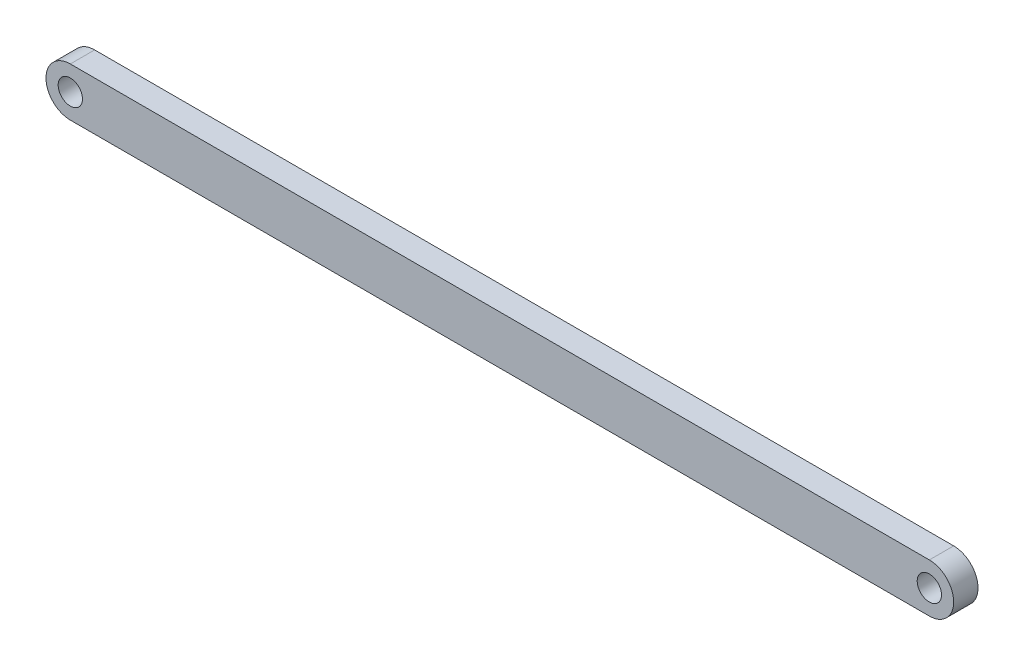
ISO-10303-21;
HEADER;
FILE_DESCRIPTION(('STEP AP214'),'2;1');
FILE_NAME('part.step','',(''),(''),'','','');
FILE_SCHEMA(('AUTOMOTIVE_DESIGN { 1 0 10303 214 1 1 1 1 }'));
ENDSEC;
DATA;
#1=APPLICATION_CONTEXT('core data for automotive mechanical design processes');
#2=APPLICATION_PROTOCOL_DEFINITION('international standard','automotive_design',2000,#1);
#3=PRODUCT_CONTEXT('',#1,'mechanical');
#4=PRODUCT('Part','Part','',(#3));
#5=PRODUCT_RELATED_PRODUCT_CATEGORY('part','',(#4));
#6=PRODUCT_DEFINITION_FORMATION('','',#4);
#7=PRODUCT_DEFINITION_CONTEXT('part definition',#1,'design');
#8=PRODUCT_DEFINITION('design','',#6,#7);
#9=PRODUCT_DEFINITION_SHAPE('','',#8);
#10=(LENGTH_UNIT() NAMED_UNIT(*) SI_UNIT(.MILLI.,.METRE.));
#11=(NAMED_UNIT(*) PLANE_ANGLE_UNIT() SI_UNIT($,.RADIAN.));
#12=(NAMED_UNIT(*) SI_UNIT($,.STERADIAN.) SOLID_ANGLE_UNIT());
#13=UNCERTAINTY_MEASURE_WITH_UNIT(LENGTH_MEASURE(1.E-05),#10,'distance_accuracy_value','');
#14=(GEOMETRIC_REPRESENTATION_CONTEXT(3) GLOBAL_UNCERTAINTY_ASSIGNED_CONTEXT((#13)) GLOBAL_UNIT_ASSIGNED_CONTEXT((#10,
#11,#12)) REPRESENTATION_CONTEXT('',''));
#15=CARTESIAN_POINT('',(0.,0.,0.));
#16=DIRECTION('',(0.,0.,1.));
#17=DIRECTION('',(1.,0.,0.));
#18=AXIS2_PLACEMENT_3D('',#15,#16,#17);
#19=CARTESIAN_POINT('',(-112.141,0.,6.35));
#20=DIRECTION('',(0.,0.,1.));
#21=DIRECTION('',(1.,0.,0.));
#22=AXIS2_PLACEMENT_3D('',#19,#20,#21);
#23=PLANE('',#22);
#24=CARTESIAN_POINT('',(-112.141,0.,6.35));
#25=DIRECTION('',(0.,0.,1.));
#26=DIRECTION('',(1.,0.,0.));
#27=AXIS2_PLACEMENT_3D('',#24,#25,#26);
#28=CIRCLE('',#27,3.175);
#29=CARTESIAN_POINT('',(-108.966,0.,6.35));
#30=VERTEX_POINT('',#29);
#31=EDGE_CURVE('E100',#30,#30,#28,.T.);
#32=ORIENTED_EDGE('',*,*,#31,.F.);
#33=EDGE_LOOP('',(#32));
#34=FACE_BOUND('',#33,.T.);
#35=CARTESIAN_POINT('',(-112.141,0.,6.35));
#36=DIRECTION('',(0.,0.,1.));
#37=DIRECTION('',(1.,0.,0.));
#38=AXIS2_PLACEMENT_3D('',#35,#36,#37);
#39=CIRCLE('',#38,6.35);
#40=CARTESIAN_POINT('',(-112.141,6.35,6.35));
#41=VERTEX_POINT('',#40);
#42=CARTESIAN_POINT('',(-112.141,-6.35,6.35));
#43=VERTEX_POINT('',#42);
#44=EDGE_CURVE('E85',#41,#43,#39,.T.);
#45=ORIENTED_EDGE('',*,*,#44,.T.);
#46=DIRECTION('',(1.,0.,0.));
#47=VECTOR('',#46,1.);
#48=CARTESIAN_POINT('',(-112.141,-6.35,6.35));
#49=LINE('',#48,#47);
#50=CARTESIAN_POINT('',(112.141,-6.34999999999996,6.35));
#51=VERTEX_POINT('',#50);
#52=EDGE_CURVE('E80',#43,#51,#49,.T.);
#53=ORIENTED_EDGE('',*,*,#52,.T.);
#54=CARTESIAN_POINT('',(112.141,0.,6.35));
#55=DIRECTION('',(0.,0.,1.));
#56=DIRECTION('',(1.,0.,0.));
#57=AXIS2_PLACEMENT_3D('',#54,#55,#56);
#58=CIRCLE('',#57,6.35);
#59=CARTESIAN_POINT('',(112.141,6.35000000000004,6.35));
#60=VERTEX_POINT('',#59);
#61=EDGE_CURVE('E83',#51,#60,#58,.T.);
#62=ORIENTED_EDGE('',*,*,#61,.T.);
#63=DIRECTION('',(-1.,0.,0.));
#64=VECTOR('',#63,1.);
#65=CARTESIAN_POINT('',(-112.141,6.35,6.35));
#66=LINE('',#65,#64);
#67=EDGE_CURVE('E50',#60,#41,#66,.T.);
#68=ORIENTED_EDGE('',*,*,#67,.T.);
#69=EDGE_LOOP('',(#45,#53,#62,#68));
#70=FACE_BOUND('',#69,.T.);
#71=CARTESIAN_POINT('',(112.141,0.,6.35));
#72=DIRECTION('',(0.,0.,1.));
#73=DIRECTION('',(1.,0.,0.));
#74=AXIS2_PLACEMENT_3D('',#71,#72,#73);
#75=CIRCLE('',#74,3.175);
#76=CARTESIAN_POINT('',(115.316,0.,6.35));
#77=VERTEX_POINT('',#76);
#78=EDGE_CURVE('E115',#77,#77,#75,.T.);
#79=ORIENTED_EDGE('',*,*,#78,.F.);
#80=EDGE_LOOP('',(#79));
#81=FACE_BOUND('',#80,.T.);
#82=ADVANCED_FACE('F33',(#34,#70,#81),#23,.T.);
#83=CARTESIAN_POINT('',(-112.141,0.,0.));
#84=DIRECTION('',(0.,0.,1.));
#85=DIRECTION('',(1.,0.,0.));
#86=AXIS2_PLACEMENT_3D('',#83,#84,#85);
#87=PLANE('',#86);
#88=CARTESIAN_POINT('',(-112.141,0.,0.));
#89=DIRECTION('',(0.,0.,1.));
#90=DIRECTION('',(1.,0.,0.));
#91=AXIS2_PLACEMENT_3D('',#88,#89,#90);
#92=CIRCLE('',#91,6.35);
#93=CARTESIAN_POINT('',(-112.141,6.35,0.));
#94=VERTEX_POINT('',#93);
#95=CARTESIAN_POINT('',(-112.141,-6.35,0.));
#96=VERTEX_POINT('',#95);
#97=EDGE_CURVE('E97',#94,#96,#92,.T.);
#98=ORIENTED_EDGE('',*,*,#97,.F.);
#99=DIRECTION('',(-1.,0.,0.));
#100=VECTOR('',#99,1.);
#101=CARTESIAN_POINT('',(-112.141,6.35,0.));
#102=LINE('',#101,#100);
#103=CARTESIAN_POINT('',(112.141,6.35000000000004,0.));
#104=VERTEX_POINT('',#103);
#105=EDGE_CURVE('E73',#104,#94,#102,.T.);
#106=ORIENTED_EDGE('',*,*,#105,.F.);
#107=CARTESIAN_POINT('',(112.141,0.,0.));
#108=DIRECTION('',(0.,0.,1.));
#109=DIRECTION('',(1.,0.,0.));
#110=AXIS2_PLACEMENT_3D('',#107,#108,#109);
#111=CIRCLE('',#110,6.35);
#112=CARTESIAN_POINT('',(112.141,-6.34999999999996,0.));
#113=VERTEX_POINT('',#112);
#114=EDGE_CURVE('E67',#113,#104,#111,.T.);
#115=ORIENTED_EDGE('',*,*,#114,.F.);
#116=DIRECTION('',(1.,0.,0.));
#117=VECTOR('',#116,1.);
#118=CARTESIAN_POINT('',(-112.141,-6.35,0.));
#119=LINE('',#118,#117);
#120=EDGE_CURVE('E89',#96,#113,#119,.T.);
#121=ORIENTED_EDGE('',*,*,#120,.F.);
#122=EDGE_LOOP('',(#98,#106,#115,#121));
#123=FACE_BOUND('',#122,.T.);
#124=CARTESIAN_POINT('',(-112.141,0.,0.));
#125=DIRECTION('',(0.,0.,1.));
#126=DIRECTION('',(1.,0.,0.));
#127=AXIS2_PLACEMENT_3D('',#124,#125,#126);
#128=CIRCLE('',#127,3.175);
#129=CARTESIAN_POINT('',(-108.966,0.,0.));
#130=VERTEX_POINT('',#129);
#131=EDGE_CURVE('E112',#130,#130,#128,.T.);
#132=ORIENTED_EDGE('',*,*,#131,.T.);
#133=EDGE_LOOP('',(#132));
#134=FACE_BOUND('',#133,.T.);
#135=CARTESIAN_POINT('',(112.141,0.,0.));
#136=DIRECTION('',(0.,0.,1.));
#137=DIRECTION('',(1.,0.,0.));
#138=AXIS2_PLACEMENT_3D('',#135,#136,#137);
#139=CIRCLE('',#138,3.175);
#140=CARTESIAN_POINT('',(115.316,0.,0.));
#141=VERTEX_POINT('',#140);
#142=EDGE_CURVE('E118',#141,#141,#139,.T.);
#143=ORIENTED_EDGE('',*,*,#142,.T.);
#144=EDGE_LOOP('',(#143));
#145=FACE_BOUND('',#144,.T.);
#146=ADVANCED_FACE('F108',(#123,#134,#145),#87,.F.);
#147=CARTESIAN_POINT('',(-112.141,0.,6.35));
#148=DIRECTION('',(0.,0.,-1.));
#149=DIRECTION('',(-1.,0.,0.));
#150=AXIS2_PLACEMENT_3D('',#147,#148,#149);
#151=CYLINDRICAL_SURFACE('',#150,6.35);
#152=ORIENTED_EDGE('',*,*,#97,.T.);
#153=DIRECTION('',(0.,0.,-1.));
#154=VECTOR('',#153,1.);
#155=CARTESIAN_POINT('',(-112.141,-6.35,6.35));
#156=LINE('',#155,#154);
#157=EDGE_CURVE('E11',#43,#96,#156,.T.);
#158=ORIENTED_EDGE('',*,*,#157,.F.);
#159=ORIENTED_EDGE('',*,*,#44,.F.);
#160=DIRECTION('',(0.,0.,-1.));
#161=VECTOR('',#160,1.);
#162=CARTESIAN_POINT('',(-112.141,6.35,6.35));
#163=LINE('',#162,#161);
#164=EDGE_CURVE('E93',#41,#94,#163,.T.);
#165=ORIENTED_EDGE('',*,*,#164,.T.);
#166=EDGE_LOOP('',(#152,#158,#159,#165));
#167=FACE_BOUND('',#166,.T.);
#168=ADVANCED_FACE('F35',(#167),#151,.T.);
#169=CARTESIAN_POINT('',(-112.141,-6.35,6.35));
#170=DIRECTION('',(0.,1.,0.));
#171=DIRECTION('',(-1.,0.,0.));
#172=AXIS2_PLACEMENT_3D('',#169,#170,#171);
#173=PLANE('',#172);
#174=ORIENTED_EDGE('',*,*,#120,.T.);
#175=DIRECTION('',(0.,0.,-1.));
#176=VECTOR('',#175,1.);
#177=CARTESIAN_POINT('',(112.141,-6.34999999999996,6.35));
#178=LINE('',#177,#176);
#179=EDGE_CURVE('E42',#51,#113,#178,.T.);
#180=ORIENTED_EDGE('',*,*,#179,.F.);
#181=ORIENTED_EDGE('',*,*,#52,.F.);
#182=ORIENTED_EDGE('',*,*,#157,.T.);
#183=EDGE_LOOP('',(#174,#180,#181,#182));
#184=FACE_BOUND('',#183,.T.);
#185=ADVANCED_FACE('F88',(#184),#173,.F.);
#186=CARTESIAN_POINT('',(112.141,0.,6.35));
#187=DIRECTION('',(0.,0.,-1.));
#188=DIRECTION('',(-1.,0.,0.));
#189=AXIS2_PLACEMENT_3D('',#186,#187,#188);
#190=CYLINDRICAL_SURFACE('',#189,6.35);
#191=ORIENTED_EDGE('',*,*,#114,.T.);
#192=DIRECTION('',(0.,0.,-1.));
#193=VECTOR('',#192,1.);
#194=CARTESIAN_POINT('',(112.141,6.35000000000004,6.35));
#195=LINE('',#194,#193);
#196=EDGE_CURVE('E90',#60,#104,#195,.T.);
#197=ORIENTED_EDGE('',*,*,#196,.F.);
#198=ORIENTED_EDGE('',*,*,#61,.F.);
#199=ORIENTED_EDGE('',*,*,#179,.T.);
#200=EDGE_LOOP('',(#191,#197,#198,#199));
#201=FACE_BOUND('',#200,.T.);
#202=ADVANCED_FACE('F91',(#201),#190,.T.);
#203=CARTESIAN_POINT('',(-112.141,6.35,6.35));
#204=DIRECTION('',(0.,-1.,0.));
#205=DIRECTION('',(1.,0.,0.));
#206=AXIS2_PLACEMENT_3D('',#203,#204,#205);
#207=PLANE('',#206);
#208=ORIENTED_EDGE('',*,*,#105,.T.);
#209=ORIENTED_EDGE('',*,*,#164,.F.);
#210=ORIENTED_EDGE('',*,*,#67,.F.);
#211=ORIENTED_EDGE('',*,*,#196,.T.);
#212=EDGE_LOOP('',(#208,#209,#210,#211));
#213=FACE_BOUND('',#212,.T.);
#214=ADVANCED_FACE('F105',(#213),#207,.F.);
#215=CARTESIAN_POINT('',(-112.141,0.,6.35));
#216=DIRECTION('',(0.,0.,-1.));
#217=DIRECTION('',(-1.,0.,0.));
#218=AXIS2_PLACEMENT_3D('',#215,#216,#217);
#219=CYLINDRICAL_SURFACE('',#218,3.175);
#220=ORIENTED_EDGE('',*,*,#31,.T.);
#221=EDGE_LOOP('',(#220));
#222=FACE_BOUND('',#221,.T.);
#223=ORIENTED_EDGE('',*,*,#131,.F.);
#224=EDGE_LOOP('',(#223));
#225=FACE_BOUND('',#224,.T.);
#226=ADVANCED_FACE('F135',(#222,#225),#219,.F.);
#227=CARTESIAN_POINT('',(112.141,0.,6.35));
#228=DIRECTION('',(0.,0.,-1.));
#229=DIRECTION('',(-1.,0.,0.));
#230=AXIS2_PLACEMENT_3D('',#227,#228,#229);
#231=CYLINDRICAL_SURFACE('',#230,3.175);
#232=ORIENTED_EDGE('',*,*,#78,.T.);
#233=EDGE_LOOP('',(#232));
#234=FACE_BOUND('',#233,.T.);
#235=ORIENTED_EDGE('',*,*,#142,.F.);
#236=EDGE_LOOP('',(#235));
#237=FACE_BOUND('',#236,.T.);
#238=ADVANCED_FACE('F124',(#234,#237),#231,.F.);
#239=CLOSED_SHELL('',(#82,#146,#168,#185,#202,#214,#226,#238));
#240=MANIFOLD_SOLID_BREP('B2',#239);
#241=ADVANCED_BREP_SHAPE_REPRESENTATION('',(#18,#240),#14);
#242=SHAPE_DEFINITION_REPRESENTATION(#9,#241);
ENDSEC;
END-ISO-10303-21;
